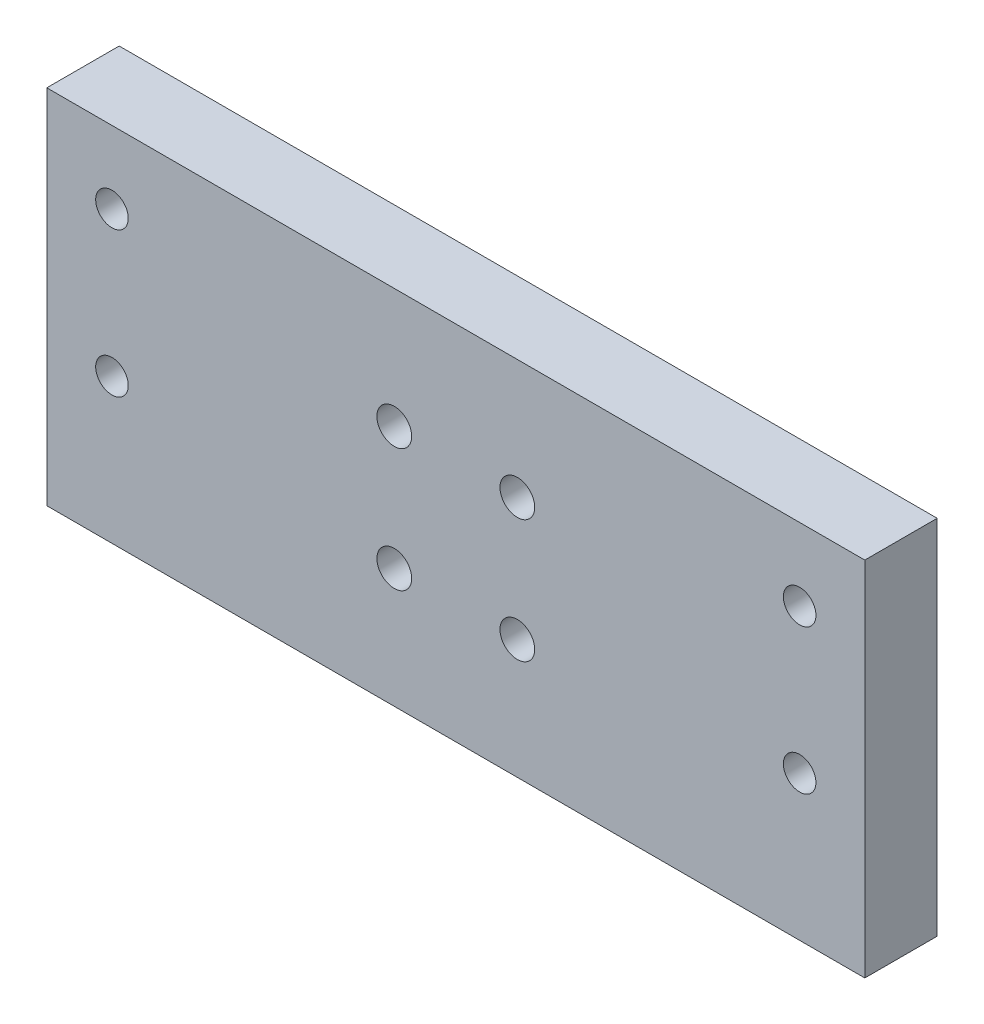
ISO-10303-21;
HEADER;
FILE_DESCRIPTION(('STEP AP214'),'2;1');
FILE_NAME('part.step','',(''),(''),'','','');
FILE_SCHEMA(('AUTOMOTIVE_DESIGN { 1 0 10303 214 1 1 1 1 }'));
ENDSEC;
DATA;
#1=APPLICATION_CONTEXT('core data for automotive mechanical design processes');
#2=APPLICATION_PROTOCOL_DEFINITION('international standard','automotive_design',2000,#1);
#3=PRODUCT_CONTEXT('',#1,'mechanical');
#4=PRODUCT('Part','Part','',(#3));
#5=PRODUCT_RELATED_PRODUCT_CATEGORY('part','',(#4));
#6=PRODUCT_DEFINITION_FORMATION('','',#4);
#7=PRODUCT_DEFINITION_CONTEXT('part definition',#1,'design');
#8=PRODUCT_DEFINITION('design','',#6,#7);
#9=PRODUCT_DEFINITION_SHAPE('','',#8);
#10=(LENGTH_UNIT() NAMED_UNIT(*) SI_UNIT(.MILLI.,.METRE.));
#11=(NAMED_UNIT(*) PLANE_ANGLE_UNIT() SI_UNIT($,.RADIAN.));
#12=(NAMED_UNIT(*) SI_UNIT($,.STERADIAN.) SOLID_ANGLE_UNIT());
#13=UNCERTAINTY_MEASURE_WITH_UNIT(LENGTH_MEASURE(1.E-05),#10,'distance_accuracy_value','');
#14=(GEOMETRIC_REPRESENTATION_CONTEXT(3) GLOBAL_UNCERTAINTY_ASSIGNED_CONTEXT((#13)) GLOBAL_UNIT_ASSIGNED_CONTEXT((#10,
#11,#12)) REPRESENTATION_CONTEXT('',''));
#15=CARTESIAN_POINT('',(0.,0.,0.));
#16=DIRECTION('',(0.,0.,1.));
#17=DIRECTION('',(1.,0.,0.));
#18=AXIS2_PLACEMENT_3D('',#15,#16,#17);
#19=CARTESIAN_POINT('',(56.5,-25.,10.));
#20=DIRECTION('',(-1.,0.,0.));
#21=DIRECTION('',(0.,0.,1.));
#22=AXIS2_PLACEMENT_3D('',#19,#20,#21);
#23=PLANE('',#22);
#24=DIRECTION('',(0.,1.,0.));
#25=VECTOR('',#24,1.);
#26=CARTESIAN_POINT('',(56.5,-25.,0.));
#27=LINE('',#26,#25);
#28=CARTESIAN_POINT('',(56.5,-25.,0.));
#29=VERTEX_POINT('',#28);
#30=CARTESIAN_POINT('',(56.5,25.,0.));
#31=VERTEX_POINT('',#30);
#32=EDGE_CURVE('E113',#29,#31,#27,.T.);
#33=ORIENTED_EDGE('',*,*,#32,.T.);
#34=DIRECTION('',(0.,0.,-1.));
#35=VECTOR('',#34,1.);
#36=CARTESIAN_POINT('',(56.5,25.,10.));
#37=LINE('',#36,#35);
#38=CARTESIAN_POINT('',(56.5,25.,10.));
#39=VERTEX_POINT('',#38);
#40=EDGE_CURVE('E11',#39,#31,#37,.T.);
#41=ORIENTED_EDGE('',*,*,#40,.F.);
#42=DIRECTION('',(0.,1.,0.));
#43=VECTOR('',#42,1.);
#44=CARTESIAN_POINT('',(56.5,-25.,10.));
#45=LINE('',#44,#43);
#46=CARTESIAN_POINT('',(56.5,-25.,10.));
#47=VERTEX_POINT('',#46);
#48=EDGE_CURVE('E95',#47,#39,#45,.T.);
#49=ORIENTED_EDGE('',*,*,#48,.F.);
#50=DIRECTION('',(0.,0.,-1.));
#51=VECTOR('',#50,1.);
#52=CARTESIAN_POINT('',(56.5,-25.,10.));
#53=LINE('',#52,#51);
#54=EDGE_CURVE('E109',#47,#29,#53,.T.);
#55=ORIENTED_EDGE('',*,*,#54,.T.);
#56=EDGE_LOOP('',(#33,#41,#49,#55));
#57=FACE_BOUND('',#56,.T.);
#58=ADVANCED_FACE('F43',(#57),#23,.F.);
#59=CARTESIAN_POINT('',(-56.5,25.,10.));
#60=DIRECTION('',(0.,-1.,0.));
#61=DIRECTION('',(0.,0.,-1.));
#62=AXIS2_PLACEMENT_3D('',#59,#60,#61);
#63=PLANE('',#62);
#64=DIRECTION('',(-1.,0.,0.));
#65=VECTOR('',#64,1.);
#66=CARTESIAN_POINT('',(-56.5,25.,0.));
#67=LINE('',#66,#65);
#68=CARTESIAN_POINT('',(-56.5,25.,0.));
#69=VERTEX_POINT('',#68);
#70=EDGE_CURVE('E100',#31,#69,#67,.T.);
#71=ORIENTED_EDGE('',*,*,#70,.T.);
#72=DIRECTION('',(0.,0.,-1.));
#73=VECTOR('',#72,1.);
#74=CARTESIAN_POINT('',(-56.5,25.,10.));
#75=LINE('',#74,#73);
#76=CARTESIAN_POINT('',(-56.5,25.,10.));
#77=VERTEX_POINT('',#76);
#78=EDGE_CURVE('E52',#77,#69,#75,.T.);
#79=ORIENTED_EDGE('',*,*,#78,.F.);
#80=DIRECTION('',(-1.,0.,0.));
#81=VECTOR('',#80,1.);
#82=CARTESIAN_POINT('',(-56.5,25.,10.));
#83=LINE('',#82,#81);
#84=EDGE_CURVE('E90',#39,#77,#83,.T.);
#85=ORIENTED_EDGE('',*,*,#84,.F.);
#86=ORIENTED_EDGE('',*,*,#40,.T.);
#87=EDGE_LOOP('',(#71,#79,#85,#86));
#88=FACE_BOUND('',#87,.T.);
#89=ADVANCED_FACE('F99',(#88),#63,.F.);
#90=CARTESIAN_POINT('',(-56.5,-25.,10.));
#91=DIRECTION('',(1.,0.,0.));
#92=DIRECTION('',(0.,0.,-1.));
#93=AXIS2_PLACEMENT_3D('',#90,#91,#92);
#94=PLANE('',#93);
#95=DIRECTION('',(0.,-1.,0.));
#96=VECTOR('',#95,1.);
#97=CARTESIAN_POINT('',(-56.5,-25.,0.));
#98=LINE('',#97,#96);
#99=CARTESIAN_POINT('',(-56.5,-25.,0.));
#100=VERTEX_POINT('',#99);
#101=EDGE_CURVE('E77',#69,#100,#98,.T.);
#102=ORIENTED_EDGE('',*,*,#101,.T.);
#103=DIRECTION('',(0.,0.,-1.));
#104=VECTOR('',#103,1.);
#105=CARTESIAN_POINT('',(-56.5,-25.,10.));
#106=LINE('',#105,#104);
#107=CARTESIAN_POINT('',(-56.5,-25.,10.));
#108=VERTEX_POINT('',#107);
#109=EDGE_CURVE('E102',#108,#100,#106,.T.);
#110=ORIENTED_EDGE('',*,*,#109,.F.);
#111=DIRECTION('',(0.,-1.,0.));
#112=VECTOR('',#111,1.);
#113=CARTESIAN_POINT('',(-56.5,-25.,10.));
#114=LINE('',#113,#112);
#115=EDGE_CURVE('E93',#77,#108,#114,.T.);
#116=ORIENTED_EDGE('',*,*,#115,.F.);
#117=ORIENTED_EDGE('',*,*,#78,.T.);
#118=EDGE_LOOP('',(#102,#110,#116,#117));
#119=FACE_BOUND('',#118,.T.);
#120=ADVANCED_FACE('F103',(#119),#94,.F.);
#121=CARTESIAN_POINT('',(-56.5,-25.,10.));
#122=DIRECTION('',(0.,1.,0.));
#123=DIRECTION('',(0.,0.,1.));
#124=AXIS2_PLACEMENT_3D('',#121,#122,#123);
#125=PLANE('',#124);
#126=DIRECTION('',(1.,0.,0.));
#127=VECTOR('',#126,1.);
#128=CARTESIAN_POINT('',(-56.5,-25.,0.));
#129=LINE('',#128,#127);
#130=EDGE_CURVE('E83',#100,#29,#129,.T.);
#131=ORIENTED_EDGE('',*,*,#130,.T.);
#132=ORIENTED_EDGE('',*,*,#54,.F.);
#133=DIRECTION('',(1.,0.,0.));
#134=VECTOR('',#133,1.);
#135=CARTESIAN_POINT('',(-56.5,-25.,10.));
#136=LINE('',#135,#134);
#137=EDGE_CURVE('E60',#108,#47,#136,.T.);
#138=ORIENTED_EDGE('',*,*,#137,.F.);
#139=ORIENTED_EDGE('',*,*,#109,.T.);
#140=EDGE_LOOP('',(#131,#132,#138,#139));
#141=FACE_BOUND('',#140,.T.);
#142=ADVANCED_FACE('F130',(#141),#125,.F.);
#143=CARTESIAN_POINT('',(0.,0.,10.));
#144=DIRECTION('',(0.,0.,-1.));
#145=DIRECTION('',(-1.,0.,0.));
#146=AXIS2_PLACEMENT_3D('',#143,#144,#145);
#147=PLANE('',#146);
#148=CARTESIAN_POINT('',(-47.5,15.,10.));
#149=DIRECTION('',(0.,0.,-1.));
#150=DIRECTION('',(1.,0.,0.));
#151=AXIS2_PLACEMENT_3D('',#148,#149,#150);
#152=CIRCLE('',#151,2.25);
#153=CARTESIAN_POINT('',(-45.25,15.,10.));
#154=VERTEX_POINT('',#153);
#155=EDGE_CURVE('E211',#154,#154,#152,.T.);
#156=ORIENTED_EDGE('',*,*,#155,.T.);
#157=EDGE_LOOP('',(#156));
#158=FACE_BOUND('',#157,.T.);
#159=CARTESIAN_POINT('',(-47.5,-4.99999999999999,10.));
#160=DIRECTION('',(0.,0.,-1.));
#161=DIRECTION('',(1.,0.,0.));
#162=AXIS2_PLACEMENT_3D('',#159,#160,#161);
#163=CIRCLE('',#162,2.25);
#164=CARTESIAN_POINT('',(-45.25,-4.99999999999999,10.));
#165=VERTEX_POINT('',#164);
#166=EDGE_CURVE('E219',#165,#165,#163,.T.);
#167=ORIENTED_EDGE('',*,*,#166,.T.);
#168=EDGE_LOOP('',(#167));
#169=FACE_BOUND('',#168,.T.);
#170=CARTESIAN_POINT('',(47.5,-5.,10.));
#171=DIRECTION('',(0.,0.,-1.));
#172=DIRECTION('',(-1.,0.,0.));
#173=AXIS2_PLACEMENT_3D('',#170,#171,#172);
#174=CIRCLE('',#173,2.25);
#175=CARTESIAN_POINT('',(45.25,-5.,10.));
#176=VERTEX_POINT('',#175);
#177=EDGE_CURVE('E204',#176,#176,#174,.T.);
#178=ORIENTED_EDGE('',*,*,#177,.T.);
#179=EDGE_LOOP('',(#178));
#180=FACE_BOUND('',#179,.T.);
#181=CARTESIAN_POINT('',(47.5,15.,10.));
#182=DIRECTION('',(0.,0.,-1.));
#183=DIRECTION('',(-1.,0.,0.));
#184=AXIS2_PLACEMENT_3D('',#181,#182,#183);
#185=CIRCLE('',#184,2.25);
#186=CARTESIAN_POINT('',(45.25,15.,10.));
#187=VERTEX_POINT('',#186);
#188=EDGE_CURVE('E199',#187,#187,#185,.T.);
#189=ORIENTED_EDGE('',*,*,#188,.T.);
#190=EDGE_LOOP('',(#189));
#191=FACE_BOUND('',#190,.T.);
#192=CARTESIAN_POINT('',(8.5,8.49999999999999,10.));
#193=DIRECTION('',(0.,0.,-1.));
#194=DIRECTION('',(-1.,0.,0.));
#195=AXIS2_PLACEMENT_3D('',#192,#193,#194);
#196=CIRCLE('',#195,2.4);
#197=CARTESIAN_POINT('',(6.1,8.49999999999999,10.));
#198=VERTEX_POINT('',#197);
#199=EDGE_CURVE('E184',#198,#198,#196,.T.);
#200=ORIENTED_EDGE('',*,*,#199,.T.);
#201=EDGE_LOOP('',(#200));
#202=FACE_BOUND('',#201,.T.);
#203=CARTESIAN_POINT('',(8.5,-8.50000000000001,10.));
#204=DIRECTION('',(0.,0.,-1.));
#205=DIRECTION('',(-1.,0.,0.));
#206=AXIS2_PLACEMENT_3D('',#203,#204,#205);
#207=CIRCLE('',#206,2.4);
#208=CARTESIAN_POINT('',(6.1,-8.50000000000001,10.));
#209=VERTEX_POINT('',#208);
#210=EDGE_CURVE('E169',#209,#209,#207,.T.);
#211=ORIENTED_EDGE('',*,*,#210,.T.);
#212=EDGE_LOOP('',(#211));
#213=FACE_BOUND('',#212,.T.);
#214=CARTESIAN_POINT('',(-8.5,-8.50000000000001,10.));
#215=DIRECTION('',(0.,0.,-1.));
#216=DIRECTION('',(-1.,0.,0.));
#217=AXIS2_PLACEMENT_3D('',#214,#215,#216);
#218=CIRCLE('',#217,2.4);
#219=CARTESIAN_POINT('',(-10.9,-8.50000000000001,10.));
#220=VERTEX_POINT('',#219);
#221=EDGE_CURVE('E154',#220,#220,#218,.T.);
#222=ORIENTED_EDGE('',*,*,#221,.T.);
#223=EDGE_LOOP('',(#222));
#224=FACE_BOUND('',#223,.T.);
#225=CARTESIAN_POINT('',(-8.5,8.49999999999999,10.));
#226=DIRECTION('',(0.,0.,-1.));
#227=DIRECTION('',(-1.,0.,0.));
#228=AXIS2_PLACEMENT_3D('',#225,#226,#227);
#229=CIRCLE('',#228,2.4);
#230=CARTESIAN_POINT('',(-10.9,8.49999999999999,10.));
#231=VERTEX_POINT('',#230);
#232=EDGE_CURVE('E117',#231,#231,#229,.T.);
#233=ORIENTED_EDGE('',*,*,#232,.T.);
#234=EDGE_LOOP('',(#233));
#235=FACE_BOUND('',#234,.T.);
#236=ORIENTED_EDGE('',*,*,#48,.T.);
#237=ORIENTED_EDGE('',*,*,#84,.T.);
#238=ORIENTED_EDGE('',*,*,#115,.T.);
#239=ORIENTED_EDGE('',*,*,#137,.T.);
#240=EDGE_LOOP('',(#236,#237,#238,#239));
#241=FACE_BOUND('',#240,.T.);
#242=ADVANCED_FACE('F91',(#158,#169,#180,#191,#202,#213,#224,#235,#241),#147,.F.);
#243=CARTESIAN_POINT('',(0.,0.,0.));
#244=DIRECTION('',(0.,0.,-1.));
#245=DIRECTION('',(-1.,0.,0.));
#246=AXIS2_PLACEMENT_3D('',#243,#244,#245);
#247=PLANE('',#246);
#248=CARTESIAN_POINT('',(-47.5,15.,0.));
#249=DIRECTION('',(0.,0.,-1.));
#250=DIRECTION('',(1.,0.,0.));
#251=AXIS2_PLACEMENT_3D('',#248,#249,#250);
#252=CIRCLE('',#251,2.25);
#253=CARTESIAN_POINT('',(-45.25,15.,0.));
#254=VERTEX_POINT('',#253);
#255=EDGE_CURVE('E208',#254,#254,#252,.T.);
#256=ORIENTED_EDGE('',*,*,#255,.F.);
#257=EDGE_LOOP('',(#256));
#258=FACE_BOUND('',#257,.T.);
#259=CARTESIAN_POINT('',(-47.5,-4.99999999999999,0.));
#260=DIRECTION('',(0.,0.,-1.));
#261=DIRECTION('',(1.,0.,0.));
#262=AXIS2_PLACEMENT_3D('',#259,#260,#261);
#263=CIRCLE('',#262,2.25);
#264=CARTESIAN_POINT('',(-45.25,-4.99999999999999,0.));
#265=VERTEX_POINT('',#264);
#266=EDGE_CURVE('E215',#265,#265,#263,.T.);
#267=ORIENTED_EDGE('',*,*,#266,.F.);
#268=EDGE_LOOP('',(#267));
#269=FACE_BOUND('',#268,.T.);
#270=CARTESIAN_POINT('',(47.5,-5.,0.));
#271=DIRECTION('',(0.,0.,-1.));
#272=DIRECTION('',(-1.,0.,0.));
#273=AXIS2_PLACEMENT_3D('',#270,#271,#272);
#274=CIRCLE('',#273,2.25);
#275=CARTESIAN_POINT('',(45.25,-5.,0.));
#276=VERTEX_POINT('',#275);
#277=EDGE_CURVE('E223',#276,#276,#274,.T.);
#278=ORIENTED_EDGE('',*,*,#277,.F.);
#279=EDGE_LOOP('',(#278));
#280=FACE_BOUND('',#279,.T.);
#281=CARTESIAN_POINT('',(47.5,15.,0.));
#282=DIRECTION('',(0.,0.,-1.));
#283=DIRECTION('',(-1.,0.,0.));
#284=AXIS2_PLACEMENT_3D('',#281,#282,#283);
#285=CIRCLE('',#284,2.25);
#286=CARTESIAN_POINT('',(45.25,15.,0.));
#287=VERTEX_POINT('',#286);
#288=EDGE_CURVE('E200',#287,#287,#285,.T.);
#289=ORIENTED_EDGE('',*,*,#288,.F.);
#290=EDGE_LOOP('',(#289));
#291=FACE_BOUND('',#290,.T.);
#292=CARTESIAN_POINT('',(8.5,8.49999999999999,0.));
#293=DIRECTION('',(0.,0.,-1.));
#294=DIRECTION('',(-1.,0.,0.));
#295=AXIS2_PLACEMENT_3D('',#292,#293,#294);
#296=CIRCLE('',#295,3.99999999999999);
#297=CARTESIAN_POINT('',(4.50000000000001,8.49999999999999,0.));
#298=VERTEX_POINT('',#297);
#299=EDGE_CURVE('E196',#298,#298,#296,.T.);
#300=ORIENTED_EDGE('',*,*,#299,.F.);
#301=EDGE_LOOP('',(#300));
#302=FACE_BOUND('',#301,.T.);
#303=CARTESIAN_POINT('',(8.5,-8.50000000000001,0.));
#304=DIRECTION('',(0.,0.,-1.));
#305=DIRECTION('',(-1.,0.,0.));
#306=AXIS2_PLACEMENT_3D('',#303,#304,#305);
#307=CIRCLE('',#306,3.99999999999999);
#308=CARTESIAN_POINT('',(4.50000000000001,-8.50000000000001,0.));
#309=VERTEX_POINT('',#308);
#310=EDGE_CURVE('E180',#309,#309,#307,.T.);
#311=ORIENTED_EDGE('',*,*,#310,.F.);
#312=EDGE_LOOP('',(#311));
#313=FACE_BOUND('',#312,.T.);
#314=CARTESIAN_POINT('',(-8.5,-8.50000000000001,0.));
#315=DIRECTION('',(0.,0.,-1.));
#316=DIRECTION('',(-1.,0.,0.));
#317=AXIS2_PLACEMENT_3D('',#314,#315,#316);
#318=CIRCLE('',#317,3.99999999999999);
#319=CARTESIAN_POINT('',(-12.5,-8.50000000000001,0.));
#320=VERTEX_POINT('',#319);
#321=EDGE_CURVE('E166',#320,#320,#318,.T.);
#322=ORIENTED_EDGE('',*,*,#321,.F.);
#323=EDGE_LOOP('',(#322));
#324=FACE_BOUND('',#323,.T.);
#325=CARTESIAN_POINT('',(-8.5,8.49999999999999,0.));
#326=DIRECTION('',(0.,0.,-1.));
#327=DIRECTION('',(-1.,0.,0.));
#328=AXIS2_PLACEMENT_3D('',#325,#326,#327);
#329=CIRCLE('',#328,3.99999999999999);
#330=CARTESIAN_POINT('',(-12.5,8.49999999999999,0.));
#331=VERTEX_POINT('',#330);
#332=EDGE_CURVE('E150',#331,#331,#329,.T.);
#333=ORIENTED_EDGE('',*,*,#332,.F.);
#334=EDGE_LOOP('',(#333));
#335=FACE_BOUND('',#334,.T.);
#336=ORIENTED_EDGE('',*,*,#32,.F.);
#337=ORIENTED_EDGE('',*,*,#130,.F.);
#338=ORIENTED_EDGE('',*,*,#101,.F.);
#339=ORIENTED_EDGE('',*,*,#70,.F.);
#340=EDGE_LOOP('',(#336,#337,#338,#339));
#341=FACE_BOUND('',#340,.T.);
#342=ADVANCED_FACE('F133',(#258,#269,#280,#291,#302,#313,#324,#335,#341),#247,.T.);
#343=CARTESIAN_POINT('',(-8.5,8.49999999999999,0.));
#344=DIRECTION('',(0.,0.,-1.));
#345=DIRECTION('',(-1.,0.,0.));
#346=AXIS2_PLACEMENT_3D('',#343,#344,#345);
#347=CYLINDRICAL_SURFACE('',#346,2.4);
#348=ORIENTED_EDGE('',*,*,#232,.F.);
#349=EDGE_LOOP('',(#348));
#350=FACE_BOUND('',#349,.T.);
#351=CARTESIAN_POINT('',(-8.5,8.49999999999999,4.));
#352=DIRECTION('',(0.,0.,-1.));
#353=DIRECTION('',(-1.,0.,0.));
#354=AXIS2_PLACEMENT_3D('',#351,#352,#353);
#355=CIRCLE('',#354,2.4);
#356=CARTESIAN_POINT('',(-10.9,8.49999999999999,4.));
#357=VERTEX_POINT('',#356);
#358=EDGE_CURVE('E143',#357,#357,#355,.T.);
#359=ORIENTED_EDGE('',*,*,#358,.T.);
#360=EDGE_LOOP('',(#359));
#361=FACE_BOUND('',#360,.T.);
#362=ADVANCED_FACE('F244',(#350,#361),#347,.F.);
#363=CARTESIAN_POINT('',(-6.1,8.49999999999999,4.));
#364=DIRECTION('',(0.,0.,1.));
#365=DIRECTION('',(1.,0.,0.));
#366=AXIS2_PLACEMENT_3D('',#363,#364,#365);
#367=PLANE('',#366);
#368=ORIENTED_EDGE('',*,*,#358,.F.);
#369=EDGE_LOOP('',(#368));
#370=FACE_BOUND('',#369,.T.);
#371=CARTESIAN_POINT('',(-8.5,8.49999999999999,4.));
#372=DIRECTION('',(0.,0.,-1.));
#373=DIRECTION('',(-1.,0.,0.));
#374=AXIS2_PLACEMENT_3D('',#371,#372,#373);
#375=CIRCLE('',#374,4.);
#376=CARTESIAN_POINT('',(-12.5,8.49999999999999,4.));
#377=VERTEX_POINT('',#376);
#378=EDGE_CURVE('E146',#377,#377,#375,.T.);
#379=ORIENTED_EDGE('',*,*,#378,.T.);
#380=EDGE_LOOP('',(#379));
#381=FACE_BOUND('',#380,.T.);
#382=ADVANCED_FACE('F260',(#370,#381),#367,.F.);
#383=CARTESIAN_POINT('',(-8.5,8.49999999999999,0.));
#384=DIRECTION('',(0.,0.,-1.));
#385=DIRECTION('',(-1.,0.,0.));
#386=AXIS2_PLACEMENT_3D('',#383,#384,#385);
#387=CYLINDRICAL_SURFACE('',#386,3.99999999999999);
#388=ORIENTED_EDGE('',*,*,#378,.F.);
#389=EDGE_LOOP('',(#388));
#390=FACE_BOUND('',#389,.T.);
#391=ORIENTED_EDGE('',*,*,#332,.T.);
#392=EDGE_LOOP('',(#391));
#393=FACE_BOUND('',#392,.T.);
#394=ADVANCED_FACE('F257',(#390,#393),#387,.F.);
#395=CARTESIAN_POINT('',(-8.5,-8.50000000000001,0.));
#396=DIRECTION('',(0.,0.,-1.));
#397=DIRECTION('',(-1.,0.,0.));
#398=AXIS2_PLACEMENT_3D('',#395,#396,#397);
#399=CYLINDRICAL_SURFACE('',#398,2.4);
#400=ORIENTED_EDGE('',*,*,#221,.F.);
#401=EDGE_LOOP('',(#400));
#402=FACE_BOUND('',#401,.T.);
#403=CARTESIAN_POINT('',(-8.5,-8.50000000000001,4.));
#404=DIRECTION('',(0.,0.,-1.));
#405=DIRECTION('',(-1.,0.,0.));
#406=AXIS2_PLACEMENT_3D('',#403,#404,#405);
#407=CIRCLE('',#406,2.4);
#408=CARTESIAN_POINT('',(-10.9,-8.50000000000001,4.));
#409=VERTEX_POINT('',#408);
#410=EDGE_CURVE('E158',#409,#409,#407,.T.);
#411=ORIENTED_EDGE('',*,*,#410,.T.);
#412=EDGE_LOOP('',(#411));
#413=FACE_BOUND('',#412,.T.);
#414=ADVANCED_FACE('F259',(#402,#413),#399,.F.);
#415=CARTESIAN_POINT('',(-6.1,-8.50000000000001,4.));
#416=DIRECTION('',(0.,0.,1.));
#417=DIRECTION('',(1.,0.,0.));
#418=AXIS2_PLACEMENT_3D('',#415,#416,#417);
#419=PLANE('',#418);
#420=ORIENTED_EDGE('',*,*,#410,.F.);
#421=EDGE_LOOP('',(#420));
#422=FACE_BOUND('',#421,.T.);
#423=CARTESIAN_POINT('',(-8.5,-8.50000000000001,4.));
#424=DIRECTION('',(0.,0.,-1.));
#425=DIRECTION('',(-1.,0.,0.));
#426=AXIS2_PLACEMENT_3D('',#423,#424,#425);
#427=CIRCLE('',#426,4.);
#428=CARTESIAN_POINT('',(-12.5,-8.50000000000001,4.));
#429=VERTEX_POINT('',#428);
#430=EDGE_CURVE('E162',#429,#429,#427,.T.);
#431=ORIENTED_EDGE('',*,*,#430,.T.);
#432=EDGE_LOOP('',(#431));
#433=FACE_BOUND('',#432,.T.);
#434=ADVANCED_FACE('F267',(#422,#433),#419,.F.);
#435=CARTESIAN_POINT('',(-8.5,-8.50000000000001,0.));
#436=DIRECTION('',(0.,0.,-1.));
#437=DIRECTION('',(-1.,0.,0.));
#438=AXIS2_PLACEMENT_3D('',#435,#436,#437);
#439=CYLINDRICAL_SURFACE('',#438,3.99999999999999);
#440=ORIENTED_EDGE('',*,*,#430,.F.);
#441=EDGE_LOOP('',(#440));
#442=FACE_BOUND('',#441,.T.);
#443=ORIENTED_EDGE('',*,*,#321,.T.);
#444=EDGE_LOOP('',(#443));
#445=FACE_BOUND('',#444,.T.);
#446=ADVANCED_FACE('F316',(#442,#445),#439,.F.);
#447=CARTESIAN_POINT('',(8.5,-8.50000000000001,0.));
#448=DIRECTION('',(0.,0.,-1.));
#449=DIRECTION('',(-1.,0.,0.));
#450=AXIS2_PLACEMENT_3D('',#447,#448,#449);
#451=CYLINDRICAL_SURFACE('',#450,2.4);
#452=ORIENTED_EDGE('',*,*,#210,.F.);
#453=EDGE_LOOP('',(#452));
#454=FACE_BOUND('',#453,.T.);
#455=CARTESIAN_POINT('',(8.5,-8.50000000000001,4.));
#456=DIRECTION('',(0.,0.,-1.));
#457=DIRECTION('',(-1.,0.,0.));
#458=AXIS2_PLACEMENT_3D('',#455,#456,#457);
#459=CIRCLE('',#458,2.4);
#460=CARTESIAN_POINT('',(6.1,-8.50000000000001,4.));
#461=VERTEX_POINT('',#460);
#462=EDGE_CURVE('E173',#461,#461,#459,.T.);
#463=ORIENTED_EDGE('',*,*,#462,.T.);
#464=EDGE_LOOP('',(#463));
#465=FACE_BOUND('',#464,.T.);
#466=ADVANCED_FACE('F325',(#454,#465),#451,.F.);
#467=CARTESIAN_POINT('',(10.9,-8.50000000000001,4.));
#468=DIRECTION('',(0.,0.,1.));
#469=DIRECTION('',(1.,0.,0.));
#470=AXIS2_PLACEMENT_3D('',#467,#468,#469);
#471=PLANE('',#470);
#472=ORIENTED_EDGE('',*,*,#462,.F.);
#473=EDGE_LOOP('',(#472));
#474=FACE_BOUND('',#473,.T.);
#475=CARTESIAN_POINT('',(8.5,-8.50000000000001,4.));
#476=DIRECTION('',(0.,0.,-1.));
#477=DIRECTION('',(-1.,0.,0.));
#478=AXIS2_PLACEMENT_3D('',#475,#476,#477);
#479=CIRCLE('',#478,4.);
#480=CARTESIAN_POINT('',(4.5,-8.50000000000001,4.));
#481=VERTEX_POINT('',#480);
#482=EDGE_CURVE('E177',#481,#481,#479,.T.);
#483=ORIENTED_EDGE('',*,*,#482,.T.);
#484=EDGE_LOOP('',(#483));
#485=FACE_BOUND('',#484,.T.);
#486=ADVANCED_FACE('F334',(#474,#485),#471,.F.);
#487=CARTESIAN_POINT('',(8.5,-8.50000000000001,0.));
#488=DIRECTION('',(0.,0.,-1.));
#489=DIRECTION('',(-1.,0.,0.));
#490=AXIS2_PLACEMENT_3D('',#487,#488,#489);
#491=CYLINDRICAL_SURFACE('',#490,3.99999999999999);
#492=ORIENTED_EDGE('',*,*,#482,.F.);
#493=EDGE_LOOP('',(#492));
#494=FACE_BOUND('',#493,.T.);
#495=ORIENTED_EDGE('',*,*,#310,.T.);
#496=EDGE_LOOP('',(#495));
#497=FACE_BOUND('',#496,.T.);
#498=ADVANCED_FACE('F343',(#494,#497),#491,.F.);
#499=CARTESIAN_POINT('',(8.5,8.49999999999999,0.));
#500=DIRECTION('',(0.,0.,-1.));
#501=DIRECTION('',(-1.,0.,0.));
#502=AXIS2_PLACEMENT_3D('',#499,#500,#501);
#503=CYLINDRICAL_SURFACE('',#502,2.4);
#504=ORIENTED_EDGE('',*,*,#199,.F.);
#505=EDGE_LOOP('',(#504));
#506=FACE_BOUND('',#505,.T.);
#507=CARTESIAN_POINT('',(8.5,8.49999999999999,4.));
#508=DIRECTION('',(0.,0.,-1.));
#509=DIRECTION('',(-1.,0.,0.));
#510=AXIS2_PLACEMENT_3D('',#507,#508,#509);
#511=CIRCLE('',#510,2.4);
#512=CARTESIAN_POINT('',(6.1,8.49999999999999,4.));
#513=VERTEX_POINT('',#512);
#514=EDGE_CURVE('E188',#513,#513,#511,.T.);
#515=ORIENTED_EDGE('',*,*,#514,.T.);
#516=EDGE_LOOP('',(#515));
#517=FACE_BOUND('',#516,.T.);
#518=ADVANCED_FACE('F352',(#506,#517),#503,.F.);
#519=CARTESIAN_POINT('',(10.9,8.49999999999999,4.));
#520=DIRECTION('',(0.,0.,1.));
#521=DIRECTION('',(1.,0.,0.));
#522=AXIS2_PLACEMENT_3D('',#519,#520,#521);
#523=PLANE('',#522);
#524=ORIENTED_EDGE('',*,*,#514,.F.);
#525=EDGE_LOOP('',(#524));
#526=FACE_BOUND('',#525,.T.);
#527=CARTESIAN_POINT('',(8.5,8.49999999999999,4.));
#528=DIRECTION('',(0.,0.,-1.));
#529=DIRECTION('',(-1.,0.,0.));
#530=AXIS2_PLACEMENT_3D('',#527,#528,#529);
#531=CIRCLE('',#530,4.);
#532=CARTESIAN_POINT('',(4.5,8.49999999999999,4.));
#533=VERTEX_POINT('',#532);
#534=EDGE_CURVE('E192',#533,#533,#531,.T.);
#535=ORIENTED_EDGE('',*,*,#534,.T.);
#536=EDGE_LOOP('',(#535));
#537=FACE_BOUND('',#536,.T.);
#538=ADVANCED_FACE('F361',(#526,#537),#523,.F.);
#539=CARTESIAN_POINT('',(8.5,8.49999999999999,0.));
#540=DIRECTION('',(0.,0.,-1.));
#541=DIRECTION('',(-1.,0.,0.));
#542=AXIS2_PLACEMENT_3D('',#539,#540,#541);
#543=CYLINDRICAL_SURFACE('',#542,3.99999999999999);
#544=ORIENTED_EDGE('',*,*,#534,.F.);
#545=EDGE_LOOP('',(#544));
#546=FACE_BOUND('',#545,.T.);
#547=ORIENTED_EDGE('',*,*,#299,.T.);
#548=EDGE_LOOP('',(#547));
#549=FACE_BOUND('',#548,.T.);
#550=ADVANCED_FACE('F370',(#546,#549),#543,.F.);
#551=CARTESIAN_POINT('',(47.5,15.,10.));
#552=DIRECTION('',(0.,0.,-1.));
#553=DIRECTION('',(-1.,0.,0.));
#554=AXIS2_PLACEMENT_3D('',#551,#552,#553);
#555=CYLINDRICAL_SURFACE('',#554,2.25);
#556=ORIENTED_EDGE('',*,*,#188,.F.);
#557=EDGE_LOOP('',(#556));
#558=FACE_BOUND('',#557,.T.);
#559=ORIENTED_EDGE('',*,*,#288,.T.);
#560=EDGE_LOOP('',(#559));
#561=FACE_BOUND('',#560,.T.);
#562=ADVANCED_FACE('F238',(#558,#561),#555,.F.);
#563=CARTESIAN_POINT('',(47.5,-5.,10.));
#564=DIRECTION('',(0.,0.,-1.));
#565=DIRECTION('',(-1.,0.,0.));
#566=AXIS2_PLACEMENT_3D('',#563,#564,#565);
#567=CYLINDRICAL_SURFACE('',#566,2.25);
#568=ORIENTED_EDGE('',*,*,#177,.F.);
#569=EDGE_LOOP('',(#568));
#570=FACE_BOUND('',#569,.T.);
#571=ORIENTED_EDGE('',*,*,#277,.T.);
#572=EDGE_LOOP('',(#571));
#573=FACE_BOUND('',#572,.T.);
#574=ADVANCED_FACE('F234',(#570,#573),#567,.F.);
#575=CARTESIAN_POINT('',(-47.5,-4.99999999999999,10.));
#576=DIRECTION('',(0.,0.,-1.));
#577=DIRECTION('',(-1.,0.,0.));
#578=AXIS2_PLACEMENT_3D('',#575,#576,#577);
#579=CYLINDRICAL_SURFACE('',#578,2.25);
#580=ORIENTED_EDGE('',*,*,#166,.F.);
#581=EDGE_LOOP('',(#580));
#582=FACE_BOUND('',#581,.T.);
#583=ORIENTED_EDGE('',*,*,#266,.T.);
#584=EDGE_LOOP('',(#583));
#585=FACE_BOUND('',#584,.T.);
#586=ADVANCED_FACE('F237',(#582,#585),#579,.F.);
#587=CARTESIAN_POINT('',(-47.5,15.,10.));
#588=DIRECTION('',(0.,0.,-1.));
#589=DIRECTION('',(-1.,0.,0.));
#590=AXIS2_PLACEMENT_3D('',#587,#588,#589);
#591=CYLINDRICAL_SURFACE('',#590,2.25);
#592=ORIENTED_EDGE('',*,*,#155,.F.);
#593=EDGE_LOOP('',(#592));
#594=FACE_BOUND('',#593,.T.);
#595=ORIENTED_EDGE('',*,*,#255,.T.);
#596=EDGE_LOOP('',(#595));
#597=FACE_BOUND('',#596,.T.);
#598=ADVANCED_FACE('F402',(#594,#597),#591,.F.);
#599=CLOSED_SHELL('',(#58,#89,#120,#142,#242,#342,#362,#382,#394,#414,#434,#446,#466,#486,#498,
#518,#538,#550,#562,#574,#586,#598));
#600=MANIFOLD_SOLID_BREP('B2',#599);
#601=ADVANCED_BREP_SHAPE_REPRESENTATION('',(#18,#600),#14);
#602=SHAPE_DEFINITION_REPRESENTATION(#9,#601);
ENDSEC;
END-ISO-10303-21;
